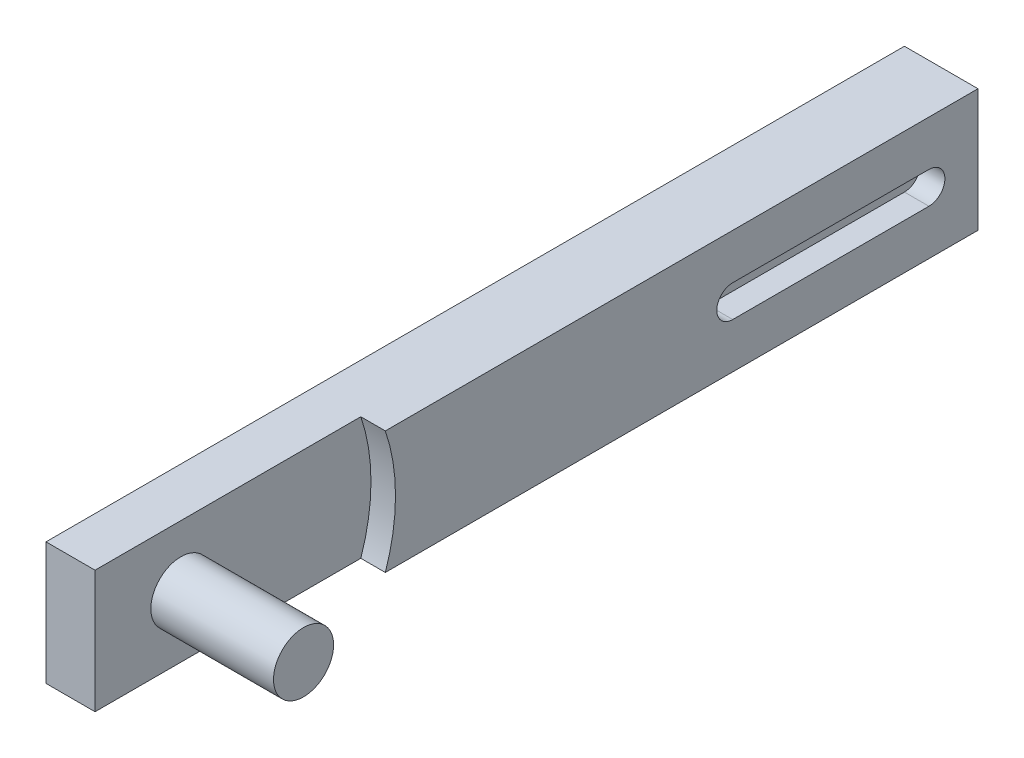
ISO-10303-21;
HEADER;
FILE_DESCRIPTION(('STEP AP214'),'2;1');
FILE_NAME('part.step','',(''),(''),'','','');
FILE_SCHEMA(('AUTOMOTIVE_DESIGN { 1 0 10303 214 1 1 1 1 }'));
ENDSEC;
DATA;
#1=APPLICATION_CONTEXT('core data for automotive mechanical design processes');
#2=APPLICATION_PROTOCOL_DEFINITION('international standard','automotive_design',2000,#1);
#3=PRODUCT_CONTEXT('',#1,'mechanical');
#4=PRODUCT('Part','Part','',(#3));
#5=PRODUCT_RELATED_PRODUCT_CATEGORY('part','',(#4));
#6=PRODUCT_DEFINITION_FORMATION('','',#4);
#7=PRODUCT_DEFINITION_CONTEXT('part definition',#1,'design');
#8=PRODUCT_DEFINITION('design','',#6,#7);
#9=PRODUCT_DEFINITION_SHAPE('','',#8);
#10=(LENGTH_UNIT() NAMED_UNIT(*) SI_UNIT(.MILLI.,.METRE.));
#11=(NAMED_UNIT(*) PLANE_ANGLE_UNIT() SI_UNIT($,.RADIAN.));
#12=(NAMED_UNIT(*) SI_UNIT($,.STERADIAN.) SOLID_ANGLE_UNIT());
#13=UNCERTAINTY_MEASURE_WITH_UNIT(LENGTH_MEASURE(1.E-05),#10,'distance_accuracy_value','');
#14=(GEOMETRIC_REPRESENTATION_CONTEXT(3) GLOBAL_UNCERTAINTY_ASSIGNED_CONTEXT((#13)) GLOBAL_UNIT_ASSIGNED_CONTEXT((#10,
#11,#12)) REPRESENTATION_CONTEXT('',''));
#15=CARTESIAN_POINT('',(0.,0.,0.));
#16=DIRECTION('',(0.,0.,1.));
#17=DIRECTION('',(1.,0.,0.));
#18=AXIS2_PLACEMENT_3D('',#15,#16,#17);
#19=CARTESIAN_POINT('',(30.,25.,175.));
#20=DIRECTION('',(0.,0.,-1.));
#21=DIRECTION('',(0.,1.,0.));
#22=AXIS2_PLACEMENT_3D('',#19,#20,#21);
#23=PLANE('',#22);
#24=DIRECTION('',(0.,-1.,0.));
#25=VECTOR('',#24,1.);
#26=CARTESIAN_POINT('',(20.,25.,175.));
#27=LINE('',#26,#25);
#28=CARTESIAN_POINT('',(20.,25.,175.));
#29=VERTEX_POINT('',#28);
#30=CARTESIAN_POINT('',(20.,-25.,175.));
#31=VERTEX_POINT('',#30);
#32=EDGE_CURVE('E173',#29,#31,#27,.T.);
#33=ORIENTED_EDGE('',*,*,#32,.F.);
#34=DIRECTION('',(-1.,0.,0.));
#35=VECTOR('',#34,1.);
#36=CARTESIAN_POINT('',(30.,25.,175.));
#37=LINE('',#36,#35);
#38=CARTESIAN_POINT('',(0.,25.,175.));
#39=VERTEX_POINT('',#38);
#40=EDGE_CURVE('E126',#29,#39,#37,.T.);
#41=ORIENTED_EDGE('',*,*,#40,.T.);
#42=DIRECTION('',(0.,-1.,0.));
#43=VECTOR('',#42,1.);
#44=CARTESIAN_POINT('',(0.,25.,175.));
#45=LINE('',#44,#43);
#46=CARTESIAN_POINT('',(0.,-25.,175.));
#47=VERTEX_POINT('',#46);
#48=EDGE_CURVE('E161',#39,#47,#45,.T.);
#49=ORIENTED_EDGE('',*,*,#48,.T.);
#50=DIRECTION('',(-1.,0.,0.));
#51=VECTOR('',#50,1.);
#52=CARTESIAN_POINT('',(30.,-25.,175.));
#53=LINE('',#52,#51);
#54=EDGE_CURVE('E145',#31,#47,#53,.T.);
#55=ORIENTED_EDGE('',*,*,#54,.F.);
#56=EDGE_LOOP('',(#33,#41,#49,#55));
#57=FACE_BOUND('',#56,.T.);
#58=ADVANCED_FACE('F33',(#57),#23,.F.);
#59=CARTESIAN_POINT('',(30.,-25.,-175.));
#60=DIRECTION('',(0.,1.,0.));
#61=DIRECTION('',(0.,0.,1.));
#62=AXIS2_PLACEMENT_3D('',#59,#60,#61);
#63=PLANE('',#62);
#64=DIRECTION('',(0.,0.,-1.));
#65=VECTOR('',#64,1.);
#66=CARTESIAN_POINT('',(30.,-25.,-175.));
#67=LINE('',#66,#65);
#68=CARTESIAN_POINT('',(30.,-25.,66.6429962443938));
#69=VERTEX_POINT('',#68);
#70=CARTESIAN_POINT('',(30.,-25.,-175.));
#71=VERTEX_POINT('',#70);
#72=EDGE_CURVE('E149',#69,#71,#67,.T.);
#73=ORIENTED_EDGE('',*,*,#72,.F.);
#74=DIRECTION('',(1.,0.,0.));
#75=VECTOR('',#74,1.);
#76=CARTESIAN_POINT('',(20.,-25.,66.6429962443938));
#77=LINE('',#76,#75);
#78=CARTESIAN_POINT('',(20.,-25.,66.6429962443938));
#79=VERTEX_POINT('',#78);
#80=EDGE_CURVE('E47',#69,#79,#77,.F.);
#81=ORIENTED_EDGE('',*,*,#80,.T.);
#82=DIRECTION('',(0.,0.,-1.));
#83=VECTOR('',#82,1.);
#84=CARTESIAN_POINT('',(20.,-25.,-175.));
#85=LINE('',#84,#83);
#86=EDGE_CURVE('E120',#31,#79,#85,.T.);
#87=ORIENTED_EDGE('',*,*,#86,.F.);
#88=ORIENTED_EDGE('',*,*,#54,.T.);
#89=DIRECTION('',(0.,0.,-1.));
#90=VECTOR('',#89,1.);
#91=CARTESIAN_POINT('',(0.,-25.,-175.));
#92=LINE('',#91,#90);
#93=CARTESIAN_POINT('',(0.,-25.,-175.));
#94=VERTEX_POINT('',#93);
#95=EDGE_CURVE('E163',#47,#94,#92,.T.);
#96=ORIENTED_EDGE('',*,*,#95,.T.);
#97=DIRECTION('',(-1.,0.,0.));
#98=VECTOR('',#97,1.);
#99=CARTESIAN_POINT('',(30.,-25.,-175.));
#100=LINE('',#99,#98);
#101=EDGE_CURVE('E136',#71,#94,#100,.T.);
#102=ORIENTED_EDGE('',*,*,#101,.F.);
#103=EDGE_LOOP('',(#73,#81,#87,#88,#96,#102));
#104=FACE_BOUND('',#103,.T.);
#105=ADVANCED_FACE('F152',(#104),#63,.F.);
#106=CARTESIAN_POINT('',(30.,25.,-175.));
#107=DIRECTION('',(0.,0.,1.));
#108=DIRECTION('',(0.,-1.,0.));
#109=AXIS2_PLACEMENT_3D('',#106,#107,#108);
#110=PLANE('',#109);
#111=DIRECTION('',(0.,1.,0.));
#112=VECTOR('',#111,1.);
#113=CARTESIAN_POINT('',(0.,25.,-175.));
#114=LINE('',#113,#112);
#115=CARTESIAN_POINT('',(0.,25.,-175.));
#116=VERTEX_POINT('',#115);
#117=EDGE_CURVE('E156',#94,#116,#114,.T.);
#118=ORIENTED_EDGE('',*,*,#117,.T.);
#119=DIRECTION('',(-1.,0.,0.));
#120=VECTOR('',#119,1.);
#121=CARTESIAN_POINT('',(30.,25.,-175.));
#122=LINE('',#121,#120);
#123=CARTESIAN_POINT('',(30.,25.,-175.));
#124=VERTEX_POINT('',#123);
#125=EDGE_CURVE('E133',#124,#116,#122,.T.);
#126=ORIENTED_EDGE('',*,*,#125,.F.);
#127=DIRECTION('',(0.,1.,0.));
#128=VECTOR('',#127,1.);
#129=CARTESIAN_POINT('',(30.,25.,-175.));
#130=LINE('',#129,#128);
#131=EDGE_CURVE('E138',#71,#124,#130,.T.);
#132=ORIENTED_EDGE('',*,*,#131,.F.);
#133=ORIENTED_EDGE('',*,*,#101,.T.);
#134=EDGE_LOOP('',(#118,#126,#132,#133));
#135=FACE_BOUND('',#134,.T.);
#136=ADVANCED_FACE('F168',(#135),#110,.F.);
#137=CARTESIAN_POINT('',(30.,25.,-175.));
#138=DIRECTION('',(0.,-1.,0.));
#139=DIRECTION('',(0.,0.,-1.));
#140=AXIS2_PLACEMENT_3D('',#137,#138,#139);
#141=PLANE('',#140);
#142=DIRECTION('',(0.,0.,1.));
#143=VECTOR('',#142,1.);
#144=CARTESIAN_POINT('',(20.,25.,-175.));
#145=LINE('',#144,#143);
#146=CARTESIAN_POINT('',(20.,25.,66.6429962443938));
#147=VERTEX_POINT('',#146);
#148=EDGE_CURVE('E11',#147,#29,#145,.T.);
#149=ORIENTED_EDGE('',*,*,#148,.F.);
#150=DIRECTION('',(1.,0.,0.));
#151=VECTOR('',#150,1.);
#152=CARTESIAN_POINT('',(20.,25.,66.6429962443938));
#153=LINE('',#152,#151);
#154=CARTESIAN_POINT('',(30.,25.,66.6429962443938));
#155=VERTEX_POINT('',#154);
#156=EDGE_CURVE('E107',#147,#155,#153,.T.);
#157=ORIENTED_EDGE('',*,*,#156,.T.);
#158=DIRECTION('',(0.,0.,1.));
#159=VECTOR('',#158,1.);
#160=CARTESIAN_POINT('',(30.,25.,-175.));
#161=LINE('',#160,#159);
#162=EDGE_CURVE('E134',#124,#155,#161,.T.);
#163=ORIENTED_EDGE('',*,*,#162,.F.);
#164=ORIENTED_EDGE('',*,*,#125,.T.);
#165=DIRECTION('',(0.,0.,1.));
#166=VECTOR('',#165,1.);
#167=CARTESIAN_POINT('',(0.,25.,-175.));
#168=LINE('',#167,#166);
#169=EDGE_CURVE('E129',#116,#39,#168,.T.);
#170=ORIENTED_EDGE('',*,*,#169,.T.);
#171=ORIENTED_EDGE('',*,*,#40,.F.);
#172=EDGE_LOOP('',(#149,#157,#163,#164,#170,#171));
#173=FACE_BOUND('',#172,.T.);
#174=ADVANCED_FACE('F124',(#173),#141,.F.);
#175=CARTESIAN_POINT('',(30.,0.,0.));
#176=DIRECTION('',(-1.,0.,0.));
#177=DIRECTION('',(0.,0.,1.));
#178=AXIS2_PLACEMENT_3D('',#175,#176,#177);
#179=PLANE('',#178);
#180=DIRECTION('',(0.,0.,1.));
#181=VECTOR('',#180,1.);
#182=CARTESIAN_POINT('',(30.,6.5,-155.));
#183=LINE('',#182,#181);
#184=CARTESIAN_POINT('',(30.,6.5,-155.));
#185=VERTEX_POINT('',#184);
#186=CARTESIAN_POINT('',(30.,6.49999999999999,-75.0000000000001));
#187=VERTEX_POINT('',#186);
#188=EDGE_CURVE('E175',#185,#187,#183,.T.);
#189=ORIENTED_EDGE('',*,*,#188,.F.);
#190=CARTESIAN_POINT('',(30.,0.,-155.));
#191=DIRECTION('',(1.,0.,0.));
#192=DIRECTION('',(0.,0.,-1.));
#193=AXIS2_PLACEMENT_3D('',#190,#191,#192);
#194=CIRCLE('',#193,6.5);
#195=CARTESIAN_POINT('',(30.,-6.5,-155.));
#196=VERTEX_POINT('',#195);
#197=EDGE_CURVE('E55',#196,#185,#194,.T.);
#198=ORIENTED_EDGE('',*,*,#197,.F.);
#199=DIRECTION('',(0.,0.,-1.));
#200=VECTOR('',#199,1.);
#201=CARTESIAN_POINT('',(30.,-6.5,-155.));
#202=LINE('',#201,#200);
#203=CARTESIAN_POINT('',(30.,-6.50000000000001,-75.0000000000001));
#204=VERTEX_POINT('',#203);
#205=EDGE_CURVE('E184',#204,#196,#202,.T.);
#206=ORIENTED_EDGE('',*,*,#205,.F.);
#207=CARTESIAN_POINT('',(30.,0.,-75.0000000000001));
#208=DIRECTION('',(1.,0.,0.));
#209=DIRECTION('',(0.,0.,-1.));
#210=AXIS2_PLACEMENT_3D('',#207,#208,#209);
#211=CIRCLE('',#210,6.5);
#212=EDGE_CURVE('E195',#187,#204,#211,.T.);
#213=ORIENTED_EDGE('',*,*,#212,.F.);
#214=EDGE_LOOP('',(#189,#198,#206,#213));
#215=FACE_BOUND('',#214,.T.);
#216=ORIENTED_EDGE('',*,*,#162,.T.);
#217=CARTESIAN_POINT('',(30.,0.,140.));
#218=DIRECTION('',(-1.,0.,0.));
#219=DIRECTION('',(0.,0.,1.));
#220=AXIS2_PLACEMENT_3D('',#217,#218,#219);
#221=CIRCLE('',#220,77.5);
#222=EDGE_CURVE('E40',#155,#69,#221,.T.);
#223=ORIENTED_EDGE('',*,*,#222,.T.);
#224=ORIENTED_EDGE('',*,*,#72,.T.);
#225=ORIENTED_EDGE('',*,*,#131,.T.);
#226=EDGE_LOOP('',(#216,#223,#224,#225));
#227=FACE_BOUND('',#226,.T.);
#228=ADVANCED_FACE('F148',(#215,#227),#179,.F.);
#229=CARTESIAN_POINT('',(0.,0.,0.));
#230=DIRECTION('',(-1.,0.,0.));
#231=DIRECTION('',(0.,0.,1.));
#232=AXIS2_PLACEMENT_3D('',#229,#230,#231);
#233=PLANE('',#232);
#234=ORIENTED_EDGE('',*,*,#48,.F.);
#235=ORIENTED_EDGE('',*,*,#169,.F.);
#236=ORIENTED_EDGE('',*,*,#117,.F.);
#237=ORIENTED_EDGE('',*,*,#95,.F.);
#238=EDGE_LOOP('',(#234,#235,#236,#237));
#239=FACE_BOUND('',#238,.T.);
#240=ADVANCED_FACE('F171',(#239),#233,.T.);
#241=CARTESIAN_POINT('',(20.,0.,-155.));
#242=DIRECTION('',(1.,0.,0.));
#243=DIRECTION('',(0.,0.,-1.));
#244=AXIS2_PLACEMENT_3D('',#241,#242,#243);
#245=CYLINDRICAL_SURFACE('',#244,6.5);
#246=ORIENTED_EDGE('',*,*,#197,.T.);
#247=DIRECTION('',(1.,0.,0.));
#248=VECTOR('',#247,1.);
#249=CARTESIAN_POINT('',(20.,6.5,-155.));
#250=LINE('',#249,#248);
#251=CARTESIAN_POINT('',(20.,6.5,-155.));
#252=VERTEX_POINT('',#251);
#253=EDGE_CURVE('E158',#252,#185,#250,.T.);
#254=ORIENTED_EDGE('',*,*,#253,.F.);
#255=CARTESIAN_POINT('',(20.,0.,-155.));
#256=DIRECTION('',(1.,0.,0.));
#257=DIRECTION('',(0.,0.,-1.));
#258=AXIS2_PLACEMENT_3D('',#255,#256,#257);
#259=CIRCLE('',#258,6.5);
#260=CARTESIAN_POINT('',(20.,-6.5,-155.));
#261=VERTEX_POINT('',#260);
#262=EDGE_CURVE('E180',#261,#252,#259,.T.);
#263=ORIENTED_EDGE('',*,*,#262,.F.);
#264=DIRECTION('',(1.,0.,0.));
#265=VECTOR('',#264,1.);
#266=CARTESIAN_POINT('',(20.,-6.5,-155.));
#267=LINE('',#266,#265);
#268=EDGE_CURVE('E164',#261,#196,#267,.T.);
#269=ORIENTED_EDGE('',*,*,#268,.T.);
#270=EDGE_LOOP('',(#246,#254,#263,#269));
#271=FACE_BOUND('',#270,.T.);
#272=ADVANCED_FACE('F219',(#271),#245,.F.);
#273=CARTESIAN_POINT('',(20.,-6.5,-155.));
#274=DIRECTION('',(0.,-1.,0.));
#275=DIRECTION('',(0.,0.,-1.));
#276=AXIS2_PLACEMENT_3D('',#273,#274,#275);
#277=PLANE('',#276);
#278=ORIENTED_EDGE('',*,*,#205,.T.);
#279=ORIENTED_EDGE('',*,*,#268,.F.);
#280=DIRECTION('',(0.,0.,-1.));
#281=VECTOR('',#280,1.);
#282=CARTESIAN_POINT('',(20.,-6.5,-155.));
#283=LINE('',#282,#281);
#284=CARTESIAN_POINT('',(20.,-6.50000000000001,-75.0000000000001));
#285=VERTEX_POINT('',#284);
#286=EDGE_CURVE('E190',#285,#261,#283,.T.);
#287=ORIENTED_EDGE('',*,*,#286,.F.);
#288=DIRECTION('',(1.,0.,0.));
#289=VECTOR('',#288,1.);
#290=CARTESIAN_POINT('',(20.,-6.50000000000001,-75.0000000000001));
#291=LINE('',#290,#289);
#292=EDGE_CURVE('E201',#285,#204,#291,.T.);
#293=ORIENTED_EDGE('',*,*,#292,.T.);
#294=EDGE_LOOP('',(#278,#279,#287,#293));
#295=FACE_BOUND('',#294,.T.);
#296=ADVANCED_FACE('F218',(#295),#277,.F.);
#297=CARTESIAN_POINT('',(20.,0.,-75.0000000000001));
#298=DIRECTION('',(1.,0.,0.));
#299=DIRECTION('',(0.,0.,-1.));
#300=AXIS2_PLACEMENT_3D('',#297,#298,#299);
#301=CYLINDRICAL_SURFACE('',#300,6.5);
#302=ORIENTED_EDGE('',*,*,#212,.T.);
#303=ORIENTED_EDGE('',*,*,#292,.F.);
#304=CARTESIAN_POINT('',(20.,0.,-75.0000000000001));
#305=DIRECTION('',(1.,0.,0.));
#306=DIRECTION('',(0.,0.,-1.));
#307=AXIS2_PLACEMENT_3D('',#304,#305,#306);
#308=CIRCLE('',#307,6.5);
#309=CARTESIAN_POINT('',(20.,6.49999999999999,-75.0000000000001));
#310=VERTEX_POINT('',#309);
#311=EDGE_CURVE('E187',#310,#285,#308,.T.);
#312=ORIENTED_EDGE('',*,*,#311,.F.);
#313=DIRECTION('',(1.,0.,0.));
#314=VECTOR('',#313,1.);
#315=CARTESIAN_POINT('',(20.,6.49999999999999,-75.0000000000001));
#316=LINE('',#315,#314);
#317=EDGE_CURVE('E202',#310,#187,#316,.T.);
#318=ORIENTED_EDGE('',*,*,#317,.T.);
#319=EDGE_LOOP('',(#302,#303,#312,#318));
#320=FACE_BOUND('',#319,.T.);
#321=ADVANCED_FACE('F213',(#320),#301,.F.);
#322=CARTESIAN_POINT('',(20.,6.5,-155.));
#323=DIRECTION('',(0.,1.,0.));
#324=DIRECTION('',(0.,0.,1.));
#325=AXIS2_PLACEMENT_3D('',#322,#323,#324);
#326=PLANE('',#325);
#327=ORIENTED_EDGE('',*,*,#188,.T.);
#328=ORIENTED_EDGE('',*,*,#317,.F.);
#329=DIRECTION('',(0.,0.,1.));
#330=VECTOR('',#329,1.);
#331=CARTESIAN_POINT('',(20.,6.5,-155.));
#332=LINE('',#331,#330);
#333=EDGE_CURVE('E183',#252,#310,#332,.T.);
#334=ORIENTED_EDGE('',*,*,#333,.F.);
#335=ORIENTED_EDGE('',*,*,#253,.T.);
#336=EDGE_LOOP('',(#327,#328,#334,#335));
#337=FACE_BOUND('',#336,.T.);
#338=ADVANCED_FACE('F208',(#337),#326,.F.);
#339=CARTESIAN_POINT('',(20.,0.,-155.));
#340=DIRECTION('',(1.,0.,0.));
#341=DIRECTION('',(0.,0.,-1.));
#342=AXIS2_PLACEMENT_3D('',#339,#340,#341);
#343=PLANE('',#342);
#344=ORIENTED_EDGE('',*,*,#262,.T.);
#345=ORIENTED_EDGE('',*,*,#333,.T.);
#346=ORIENTED_EDGE('',*,*,#311,.T.);
#347=ORIENTED_EDGE('',*,*,#286,.T.);
#348=EDGE_LOOP('',(#344,#345,#346,#347));
#349=FACE_BOUND('',#348,.T.);
#350=ADVANCED_FACE('F217',(#349),#343,.T.);
#351=CARTESIAN_POINT('',(20.,0.,140.));
#352=DIRECTION('',(1.,0.,0.));
#353=DIRECTION('',(0.,0.,-1.));
#354=AXIS2_PLACEMENT_3D('',#351,#352,#353);
#355=PLANE('',#354);
#356=CARTESIAN_POINT('',(20.,0.,140.));
#357=DIRECTION('',(1.,0.,0.));
#358=DIRECTION('',(0.,0.,-1.));
#359=AXIS2_PLACEMENT_3D('',#356,#357,#358);
#360=CIRCLE('',#359,12.25);
#361=CARTESIAN_POINT('',(20.,0.,127.75));
#362=VERTEX_POINT('',#361);
#363=EDGE_CURVE('E344',#362,#362,#360,.T.);
#364=ORIENTED_EDGE('',*,*,#363,.F.);
#365=EDGE_LOOP('',(#364));
#366=FACE_BOUND('',#365,.T.);
#367=ORIENTED_EDGE('',*,*,#86,.T.);
#368=CARTESIAN_POINT('',(20.,0.,140.));
#369=DIRECTION('',(1.,0.,0.));
#370=DIRECTION('',(0.,0.,-1.));
#371=AXIS2_PLACEMENT_3D('',#368,#369,#370);
#372=CIRCLE('',#371,77.5);
#373=EDGE_CURVE('E110',#79,#147,#372,.T.);
#374=ORIENTED_EDGE('',*,*,#373,.T.);
#375=ORIENTED_EDGE('',*,*,#148,.T.);
#376=ORIENTED_EDGE('',*,*,#32,.T.);
#377=EDGE_LOOP('',(#367,#374,#375,#376));
#378=FACE_BOUND('',#377,.T.);
#379=ADVANCED_FACE('F117',(#366,#378),#355,.T.);
#380=CARTESIAN_POINT('',(20.,0.,140.));
#381=DIRECTION('',(1.,0.,0.));
#382=DIRECTION('',(0.,0.,-1.));
#383=AXIS2_PLACEMENT_3D('',#380,#381,#382);
#384=CYLINDRICAL_SURFACE('',#383,77.5);
#385=ORIENTED_EDGE('',*,*,#222,.F.);
#386=ORIENTED_EDGE('',*,*,#156,.F.);
#387=ORIENTED_EDGE('',*,*,#373,.F.);
#388=ORIENTED_EDGE('',*,*,#80,.F.);
#389=EDGE_LOOP('',(#385,#386,#387,#388));
#390=FACE_BOUND('',#389,.T.);
#391=ADVANCED_FACE('F109',(#390),#384,.F.);
#392=CARTESIAN_POINT('',(70.,0.,140.));
#393=DIRECTION('',(-1.,0.,0.));
#394=DIRECTION('',(0.,0.,1.));
#395=AXIS2_PLACEMENT_3D('',#392,#393,#394);
#396=CYLINDRICAL_SURFACE('',#395,12.25);
#397=CARTESIAN_POINT('',(70.,0.,140.));
#398=DIRECTION('',(1.,0.,0.));
#399=DIRECTION('',(0.,0.,-1.));
#400=AXIS2_PLACEMENT_3D('',#397,#398,#399);
#401=CIRCLE('',#400,12.25);
#402=CARTESIAN_POINT('',(70.,0.,127.75));
#403=VERTEX_POINT('',#402);
#404=EDGE_CURVE('E121',#403,#403,#401,.T.);
#405=ORIENTED_EDGE('',*,*,#404,.F.);
#406=EDGE_LOOP('',(#405));
#407=FACE_BOUND('',#406,.T.);
#408=ORIENTED_EDGE('',*,*,#363,.T.);
#409=EDGE_LOOP('',(#408));
#410=FACE_BOUND('',#409,.T.);
#411=ADVANCED_FACE('F320',(#407,#410),#396,.T.);
#412=CARTESIAN_POINT('',(70.,0.,140.));
#413=DIRECTION('',(1.,0.,0.));
#414=DIRECTION('',(0.,0.,-1.));
#415=AXIS2_PLACEMENT_3D('',#412,#413,#414);
#416=PLANE('',#415);
#417=ORIENTED_EDGE('',*,*,#404,.T.);
#418=EDGE_LOOP('',(#417));
#419=FACE_BOUND('',#418,.T.);
#420=ADVANCED_FACE('F327',(#419),#416,.T.);
#421=CLOSED_SHELL('',(#58,#105,#136,#174,#228,#240,#272,#296,#321,#338,#350,#379,#391,#411,#420));
#422=MANIFOLD_SOLID_BREP('B2',#421);
#423=ADVANCED_BREP_SHAPE_REPRESENTATION('',(#18,#422),#14);
#424=SHAPE_DEFINITION_REPRESENTATION(#9,#423);
ENDSEC;
END-ISO-10303-21;
